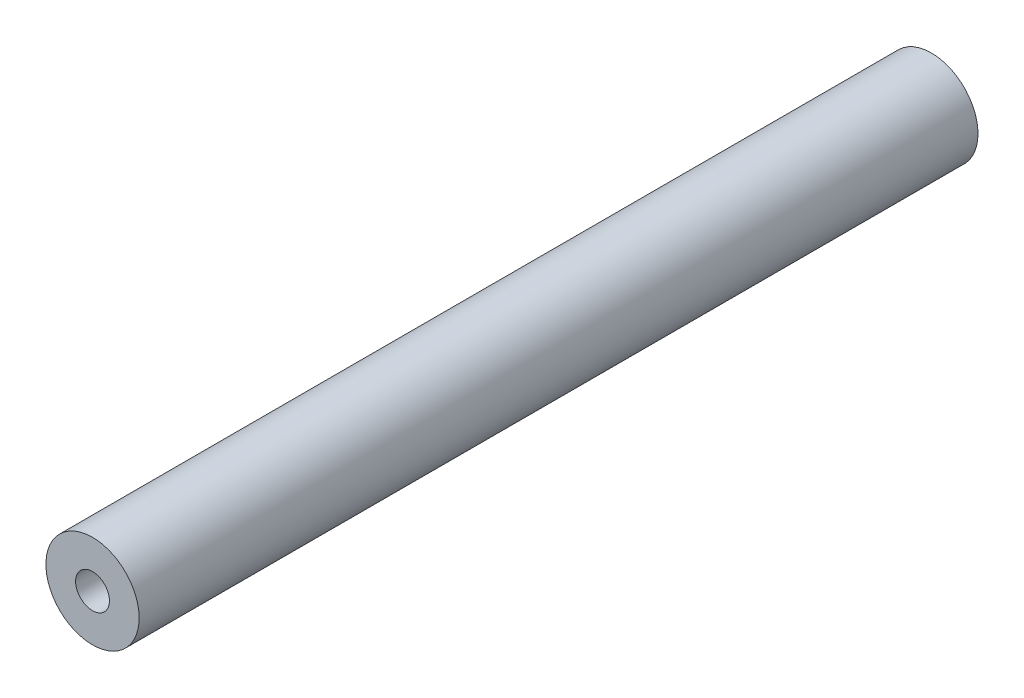
ISO-10303-21;
HEADER;
FILE_DESCRIPTION(('STEP AP214'),'2;1');
FILE_NAME('part.step','',(''),(''),'','','');
FILE_SCHEMA(('AUTOMOTIVE_DESIGN { 1 0 10303 214 1 1 1 1 }'));
ENDSEC;
DATA;
#1=APPLICATION_CONTEXT('core data for automotive mechanical design processes');
#2=APPLICATION_PROTOCOL_DEFINITION('international standard','automotive_design',2000,#1);
#3=PRODUCT_CONTEXT('',#1,'mechanical');
#4=PRODUCT('Part','Part','',(#3));
#5=PRODUCT_RELATED_PRODUCT_CATEGORY('part','',(#4));
#6=PRODUCT_DEFINITION_FORMATION('','',#4);
#7=PRODUCT_DEFINITION_CONTEXT('part definition',#1,'design');
#8=PRODUCT_DEFINITION('design','',#6,#7);
#9=PRODUCT_DEFINITION_SHAPE('','',#8);
#10=(LENGTH_UNIT() NAMED_UNIT(*) SI_UNIT(.MILLI.,.METRE.));
#11=(NAMED_UNIT(*) PLANE_ANGLE_UNIT() SI_UNIT($,.RADIAN.));
#12=(NAMED_UNIT(*) SI_UNIT($,.STERADIAN.) SOLID_ANGLE_UNIT());
#13=UNCERTAINTY_MEASURE_WITH_UNIT(LENGTH_MEASURE(1.E-05),#10,'distance_accuracy_value','');
#14=(GEOMETRIC_REPRESENTATION_CONTEXT(3) GLOBAL_UNCERTAINTY_ASSIGNED_CONTEXT((#13)) GLOBAL_UNIT_ASSIGNED_CONTEXT((#10,
#11,#12)) REPRESENTATION_CONTEXT('',''));
#15=CARTESIAN_POINT('',(0.,0.,0.));
#16=DIRECTION('',(0.,0.,1.));
#17=DIRECTION('',(1.,0.,0.));
#18=AXIS2_PLACEMENT_3D('',#15,#16,#17);
#19=CARTESIAN_POINT('',(0.,0.,65.056349186104));
#20=DIRECTION('',(0.,0.,-1.));
#21=DIRECTION('',(-1.,0.,0.));
#22=AXIS2_PLACEMENT_3D('',#19,#20,#21);
#23=CYLINDRICAL_SURFACE('',#22,5.5);
#24=CARTESIAN_POINT('',(0.,0.,49.5));
#25=DIRECTION('',(0.,0.,1.));
#26=DIRECTION('',(1.,0.,0.));
#27=AXIS2_PLACEMENT_3D('',#24,#25,#26);
#28=CIRCLE('',#27,5.5);
#29=CARTESIAN_POINT('',(5.5,0.,49.5));
#30=VERTEX_POINT('',#29);
#31=EDGE_CURVE('E10',#30,#30,#28,.T.);
#32=ORIENTED_EDGE('',*,*,#31,.F.);
#33=EDGE_LOOP('',(#32));
#34=FACE_BOUND('',#33,.T.);
#35=CARTESIAN_POINT('',(0.,0.,-49.5));
#36=DIRECTION('',(0.,0.,1.));
#37=DIRECTION('',(1.,0.,0.));
#38=AXIS2_PLACEMENT_3D('',#35,#36,#37);
#39=CIRCLE('',#38,5.5);
#40=CARTESIAN_POINT('',(5.5,0.,-49.5));
#41=VERTEX_POINT('',#40);
#42=EDGE_CURVE('E23',#41,#41,#39,.F.);
#43=ORIENTED_EDGE('',*,*,#42,.F.);
#44=EDGE_LOOP('',(#43));
#45=FACE_BOUND('',#44,.T.);
#46=ADVANCED_FACE('F15',(#34,#45),#23,.T.);
#47=CARTESIAN_POINT('',(0.,0.,49.5));
#48=DIRECTION('',(0.,0.,1.));
#49=DIRECTION('',(1.,0.,0.));
#50=AXIS2_PLACEMENT_3D('',#47,#48,#49);
#51=PLANE('',#50);
#52=CARTESIAN_POINT('',(0.,0.,49.5));
#53=DIRECTION('',(0.,0.,1.));
#54=DIRECTION('',(1.,0.,0.));
#55=AXIS2_PLACEMENT_3D('',#52,#53,#54);
#56=CIRCLE('',#55,2.);
#57=CARTESIAN_POINT('',(2.,0.,49.5));
#58=VERTEX_POINT('',#57);
#59=EDGE_CURVE('E34',#58,#58,#56,.F.);
#60=ORIENTED_EDGE('',*,*,#59,.T.);
#61=EDGE_LOOP('',(#60));
#62=FACE_BOUND('',#61,.T.);
#63=ORIENTED_EDGE('',*,*,#31,.T.);
#64=EDGE_LOOP('',(#63));
#65=FACE_BOUND('',#64,.T.);
#66=ADVANCED_FACE('F17',(#62,#65),#51,.T.);
#67=CARTESIAN_POINT('',(0.,0.,-49.5));
#68=DIRECTION('',(0.,0.,1.));
#69=DIRECTION('',(1.,0.,0.));
#70=AXIS2_PLACEMENT_3D('',#67,#68,#69);
#71=PLANE('',#70);
#72=ORIENTED_EDGE('',*,*,#42,.T.);
#73=EDGE_LOOP('',(#72));
#74=FACE_BOUND('',#73,.T.);
#75=ADVANCED_FACE('F62',(#74),#71,.F.);
#76=CARTESIAN_POINT('',(0.,0.,90.));
#77=DIRECTION('',(0.,0.,-1.));
#78=DIRECTION('',(-1.,0.,0.));
#79=AXIS2_PLACEMENT_3D('',#76,#77,#78);
#80=CYLINDRICAL_SURFACE('',#79,2.);
#81=ORIENTED_EDGE('',*,*,#59,.F.);
#82=EDGE_LOOP('',(#81));
#83=FACE_BOUND('',#82,.T.);
#84=CARTESIAN_POINT('',(0.,0.,40.));
#85=DIRECTION('',(0.,0.,1.));
#86=DIRECTION('',(1.,0.,0.));
#87=AXIS2_PLACEMENT_3D('',#84,#85,#86);
#88=CIRCLE('',#87,2.);
#89=CARTESIAN_POINT('',(2.,0.,40.));
#90=VERTEX_POINT('',#89);
#91=EDGE_CURVE('E19',#90,#90,#88,.F.);
#92=ORIENTED_EDGE('',*,*,#91,.T.);
#93=EDGE_LOOP('',(#92));
#94=FACE_BOUND('',#93,.T.);
#95=ADVANCED_FACE('F45',(#83,#94),#80,.F.);
#96=CARTESIAN_POINT('',(0.,0.,-54.142135623731));
#97=DIRECTION('',(0.,0.,1.));
#98=DIRECTION('',(1.,0.,0.));
#99=AXIS2_PLACEMENT_3D('',#96,#97,#98);
#100=CYLINDRICAL_SURFACE('',#99,5.);
#101=CARTESIAN_POINT('',(0.,0.,-40.));
#102=DIRECTION('',(0.,0.,1.));
#103=DIRECTION('',(1.,0.,0.));
#104=AXIS2_PLACEMENT_3D('',#101,#102,#103);
#105=CIRCLE('',#104,5.);
#106=CARTESIAN_POINT('',(5.,0.,-40.));
#107=VERTEX_POINT('',#106);
#108=EDGE_CURVE('E30',#107,#107,#105,.F.);
#109=ORIENTED_EDGE('',*,*,#108,.T.);
#110=EDGE_LOOP('',(#109));
#111=FACE_BOUND('',#110,.T.);
#112=CARTESIAN_POINT('',(0.,0.,40.));
#113=DIRECTION('',(0.,0.,1.));
#114=DIRECTION('',(1.,0.,0.));
#115=AXIS2_PLACEMENT_3D('',#112,#113,#114);
#116=CIRCLE('',#115,5.);
#117=CARTESIAN_POINT('',(5.,0.,40.));
#118=VERTEX_POINT('',#117);
#119=EDGE_CURVE('E32',#118,#118,#116,.T.);
#120=ORIENTED_EDGE('',*,*,#119,.T.);
#121=EDGE_LOOP('',(#120));
#122=FACE_BOUND('',#121,.T.);
#123=ADVANCED_FACE('F51',(#111,#122),#100,.F.);
#124=CARTESIAN_POINT('',(0.,0.,-40.));
#125=DIRECTION('',(0.,0.,1.));
#126=DIRECTION('',(1.,0.,0.));
#127=AXIS2_PLACEMENT_3D('',#124,#125,#126);
#128=PLANE('',#127);
#129=ORIENTED_EDGE('',*,*,#108,.F.);
#130=EDGE_LOOP('',(#129));
#131=FACE_BOUND('',#130,.T.);
#132=ADVANCED_FACE('F50',(#131),#128,.T.);
#133=CARTESIAN_POINT('',(0.,0.,40.));
#134=DIRECTION('',(0.,0.,1.));
#135=DIRECTION('',(1.,0.,0.));
#136=AXIS2_PLACEMENT_3D('',#133,#134,#135);
#137=PLANE('',#136);
#138=ORIENTED_EDGE('',*,*,#91,.F.);
#139=EDGE_LOOP('',(#138));
#140=FACE_BOUND('',#139,.T.);
#141=ORIENTED_EDGE('',*,*,#119,.F.);
#142=EDGE_LOOP('',(#141));
#143=FACE_BOUND('',#142,.T.);
#144=ADVANCED_FACE('F42',(#140,#143),#137,.F.);
#145=CLOSED_SHELL('',(#46,#66,#75,#95,#123,#132,#144));
#146=MANIFOLD_SOLID_BREP('B1',#145);
#147=ADVANCED_BREP_SHAPE_REPRESENTATION('',(#18,#146),#14);
#148=SHAPE_DEFINITION_REPRESENTATION(#9,#147);
ENDSEC;
END-ISO-10303-21;
